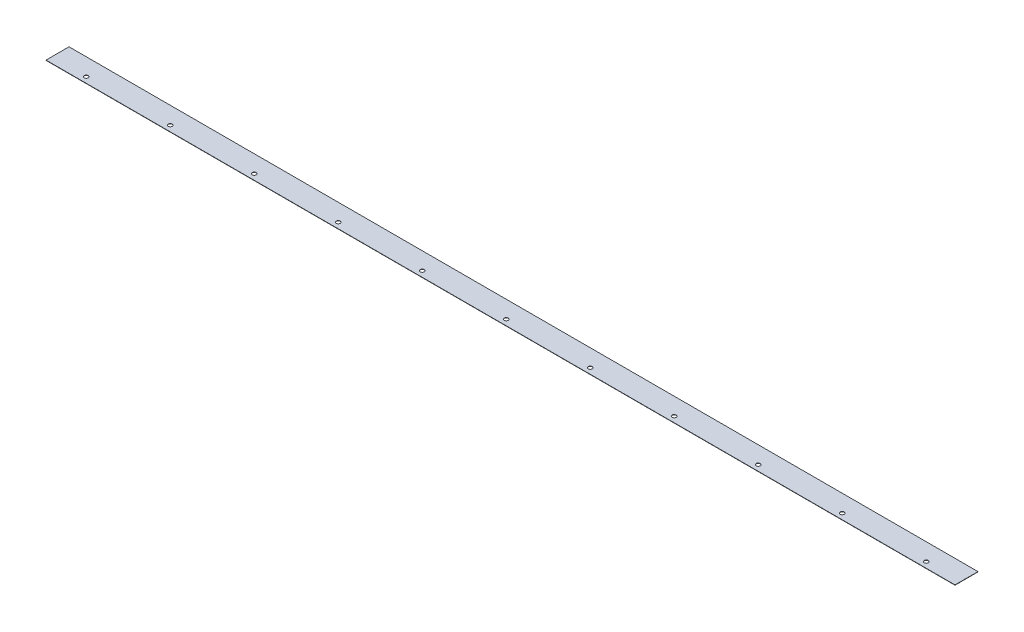
ISO-10303-21;
HEADER;
FILE_DESCRIPTION(('STEP AP214'),'2;1');
FILE_NAME('part.step','',(''),(''),'','','');
FILE_SCHEMA(('AUTOMOTIVE_DESIGN { 1 0 10303 214 1 1 1 1 }'));
ENDSEC;
DATA;
#1=APPLICATION_CONTEXT('core data for automotive mechanical design processes');
#2=APPLICATION_PROTOCOL_DEFINITION('international standard','automotive_design',2000,#1);
#3=PRODUCT_CONTEXT('',#1,'mechanical');
#4=PRODUCT('Part','Part','',(#3));
#5=PRODUCT_RELATED_PRODUCT_CATEGORY('part','',(#4));
#6=PRODUCT_DEFINITION_FORMATION('','',#4);
#7=PRODUCT_DEFINITION_CONTEXT('part definition',#1,'design');
#8=PRODUCT_DEFINITION('design','',#6,#7);
#9=PRODUCT_DEFINITION_SHAPE('','',#8);
#10=(LENGTH_UNIT() NAMED_UNIT(*) SI_UNIT(.MILLI.,.METRE.));
#11=(NAMED_UNIT(*) PLANE_ANGLE_UNIT() SI_UNIT($,.RADIAN.));
#12=(NAMED_UNIT(*) SI_UNIT($,.STERADIAN.) SOLID_ANGLE_UNIT());
#13=UNCERTAINTY_MEASURE_WITH_UNIT(LENGTH_MEASURE(1.E-05),#10,'distance_accuracy_value','');
#14=(GEOMETRIC_REPRESENTATION_CONTEXT(3) GLOBAL_UNCERTAINTY_ASSIGNED_CONTEXT((#13)) GLOBAL_UNIT_ASSIGNED_CONTEXT((#10,
#11,#12)) REPRESENTATION_CONTEXT('',''));
#15=CARTESIAN_POINT('',(0.,0.,0.));
#16=DIRECTION('',(0.,0.,1.));
#17=DIRECTION('',(1.,0.,0.));
#18=AXIS2_PLACEMENT_3D('',#15,#16,#17);
#19=CARTESIAN_POINT('',(790.000000000001,-0.499999999999806,20.));
#20=DIRECTION('',(1.,0.,0.));
#21=DIRECTION('',(0.,0.,-1.00000000000001));
#22=AXIS2_PLACEMENT_3D('',#19,#20,#21);
#23=PLANE('',#22);
#24=DIRECTION('',(0.,0.,-1.00000000000001));
#25=VECTOR('',#24,1.);
#26=CARTESIAN_POINT('',(790.000000000001,2.4980018054066E-13,19.9999999999999));
#27=LINE('',#26,#25);
#28=CARTESIAN_POINT('',(790.000000000001,2.4980018054066E-13,19.9999999999999));
#29=VERTEX_POINT('',#28);
#30=CARTESIAN_POINT('',(790.000000000001,2.4980018054066E-13,-19.9999999999998));
#31=VERTEX_POINT('',#30);
#32=EDGE_CURVE('E103',#29,#31,#27,.T.);
#33=ORIENTED_EDGE('',*,*,#32,.F.);
#34=DIRECTION('',(0.,1.,0.));
#35=VECTOR('',#34,1.);
#36=CARTESIAN_POINT('',(790.000000000001,-0.499999999999806,20.));
#37=LINE('',#36,#35);
#38=CARTESIAN_POINT('',(790.000000000001,-0.499999999999806,20.));
#39=VERTEX_POINT('',#38);
#40=EDGE_CURVE('E11',#39,#29,#37,.T.);
#41=ORIENTED_EDGE('',*,*,#40,.F.);
#42=DIRECTION('',(0.,0.,-1.00000000000001));
#43=VECTOR('',#42,1.);
#44=CARTESIAN_POINT('',(790.000000000001,-0.499999999999806,20.));
#45=LINE('',#44,#43);
#46=CARTESIAN_POINT('',(790.000000000001,-0.5,-20.));
#47=VERTEX_POINT('',#46);
#48=EDGE_CURVE('E96',#39,#47,#45,.T.);
#49=ORIENTED_EDGE('',*,*,#48,.T.);
#50=DIRECTION('',(0.,1.,0.));
#51=VECTOR('',#50,1.);
#52=CARTESIAN_POINT('',(790.000000000001,-0.5,-20.));
#53=LINE('',#52,#51);
#54=EDGE_CURVE('E41',#47,#31,#53,.T.);
#55=ORIENTED_EDGE('',*,*,#54,.T.);
#56=EDGE_LOOP('',(#33,#41,#49,#55));
#57=FACE_BOUND('',#56,.T.);
#58=ADVANCED_FACE('F38',(#57),#23,.T.);
#59=CARTESIAN_POINT('',(-790.000000000003,-0.500000000000334,20.));
#60=DIRECTION('',(0.,0.,1.00000000000001));
#61=DIRECTION('',(1.,0.,0.));
#62=AXIS2_PLACEMENT_3D('',#59,#60,#61);
#63=PLANE('',#62);
#64=DIRECTION('',(1.,0.,0.));
#65=VECTOR('',#64,1.);
#66=CARTESIAN_POINT('',(-790.000000000003,0.,20.0000000000001));
#67=LINE('',#66,#65);
#68=CARTESIAN_POINT('',(-790.000000000003,0.,20.0000000000001));
#69=VERTEX_POINT('',#68);
#70=EDGE_CURVE('E98',#69,#29,#67,.T.);
#71=ORIENTED_EDGE('',*,*,#70,.F.);
#72=DIRECTION('',(0.,1.,0.));
#73=VECTOR('',#72,1.);
#74=CARTESIAN_POINT('',(-790.000000000003,-0.500000000000334,20.));
#75=LINE('',#74,#73);
#76=CARTESIAN_POINT('',(-790.000000000003,-0.500000000000334,20.));
#77=VERTEX_POINT('',#76);
#78=EDGE_CURVE('E47',#77,#69,#75,.T.);
#79=ORIENTED_EDGE('',*,*,#78,.F.);
#80=DIRECTION('',(1.,0.,0.));
#81=VECTOR('',#80,1.);
#82=CARTESIAN_POINT('',(-790.000000000003,-0.500000000000334,20.));
#83=LINE('',#82,#81);
#84=EDGE_CURVE('E93',#77,#39,#83,.T.);
#85=ORIENTED_EDGE('',*,*,#84,.T.);
#86=ORIENTED_EDGE('',*,*,#40,.T.);
#87=EDGE_LOOP('',(#71,#79,#85,#86));
#88=FACE_BOUND('',#87,.T.);
#89=ADVANCED_FACE('F114',(#88),#63,.T.);
#90=CARTESIAN_POINT('',(-790.000000000003,-0.500000000000334,20.));
#91=DIRECTION('',(-1.,0.,0.));
#92=DIRECTION('',(0.,0.,1.00000000000001));
#93=AXIS2_PLACEMENT_3D('',#90,#91,#92);
#94=PLANE('',#93);
#95=DIRECTION('',(0.,0.,1.00000000000001));
#96=VECTOR('',#95,1.);
#97=CARTESIAN_POINT('',(-790.000000000003,0.,20.0000000000001));
#98=LINE('',#97,#96);
#99=CARTESIAN_POINT('',(-790.000000000004,1.11022302462516E-13,-19.9999999999997));
#100=VERTEX_POINT('',#99);
#101=EDGE_CURVE('E88',#100,#69,#98,.T.);
#102=ORIENTED_EDGE('',*,*,#101,.F.);
#103=DIRECTION('',(0.,1.,0.));
#104=VECTOR('',#103,1.);
#105=CARTESIAN_POINT('',(-790.000000000004,-0.499999999999778,-19.9999999999999));
#106=LINE('',#105,#104);
#107=CARTESIAN_POINT('',(-790.000000000004,-0.499999999999778,-19.9999999999999));
#108=VERTEX_POINT('',#107);
#109=EDGE_CURVE('E83',#108,#100,#106,.T.);
#110=ORIENTED_EDGE('',*,*,#109,.F.);
#111=DIRECTION('',(0.,0.,1.00000000000001));
#112=VECTOR('',#111,1.);
#113=CARTESIAN_POINT('',(-790.000000000003,-0.500000000000334,20.));
#114=LINE('',#113,#112);
#115=EDGE_CURVE('E86',#108,#77,#114,.T.);
#116=ORIENTED_EDGE('',*,*,#115,.T.);
#117=ORIENTED_EDGE('',*,*,#78,.T.);
#118=EDGE_LOOP('',(#102,#110,#116,#117));
#119=FACE_BOUND('',#118,.T.);
#120=ADVANCED_FACE('F85',(#119),#94,.T.);
#121=CARTESIAN_POINT('',(-790.000000000004,-0.499999999999778,-19.9999999999999));
#122=DIRECTION('',(0.,0.,-1.00000000000001));
#123=DIRECTION('',(-1.,0.,0.));
#124=AXIS2_PLACEMENT_3D('',#121,#122,#123);
#125=PLANE('',#124);
#126=DIRECTION('',(-1.,0.,0.));
#127=VECTOR('',#126,1.);
#128=CARTESIAN_POINT('',(-790.000000000004,1.11022302462516E-13,-19.9999999999997));
#129=LINE('',#128,#127);
#130=EDGE_CURVE('E106',#31,#100,#129,.T.);
#131=ORIENTED_EDGE('',*,*,#130,.F.);
#132=ORIENTED_EDGE('',*,*,#54,.F.);
#133=DIRECTION('',(-1.,0.,0.));
#134=VECTOR('',#133,1.);
#135=CARTESIAN_POINT('',(-790.000000000004,-0.499999999999778,-19.9999999999999));
#136=LINE('',#135,#134);
#137=EDGE_CURVE('E92',#47,#108,#136,.T.);
#138=ORIENTED_EDGE('',*,*,#137,.T.);
#139=ORIENTED_EDGE('',*,*,#109,.T.);
#140=EDGE_LOOP('',(#131,#132,#138,#139));
#141=FACE_BOUND('',#140,.T.);
#142=ADVANCED_FACE('F95',(#141),#125,.T.);
#143=CARTESIAN_POINT('',(0.,-0.499999999999889,2.08166817117217E-13));
#144=DIRECTION('',(0.,-1.,0.));
#145=DIRECTION('',(0.,0.,-1.00000000000001));
#146=AXIS2_PLACEMENT_3D('',#143,#144,#145);
#147=PLANE('',#146);
#148=CARTESIAN_POINT('',(730.,-0.500000000000028,10.0000000000001));
#149=DIRECTION('',(0.,-1.,0.));
#150=DIRECTION('',(0.,0.,-1.00000000000001));
#151=AXIS2_PLACEMENT_3D('',#148,#149,#150);
#152=CIRCLE('',#151,3.5);
#153=CARTESIAN_POINT('',(730.,-0.500000000000028,6.50000000000013));
#154=VERTEX_POINT('',#153);
#155=EDGE_CURVE('E239',#154,#154,#152,.T.);
#156=ORIENTED_EDGE('',*,*,#155,.F.);
#157=EDGE_LOOP('',(#156));
#158=FACE_BOUND('',#157,.T.);
#159=CARTESIAN_POINT('',(584.,-0.499999999999889,10.0000000000002));
#160=DIRECTION('',(0.,-1.,0.));
#161=DIRECTION('',(0.,0.,-1.00000000000001));
#162=AXIS2_PLACEMENT_3D('',#159,#160,#161);
#163=CIRCLE('',#162,3.5);
#164=CARTESIAN_POINT('',(584.,-0.499999999999889,6.50000000000021));
#165=VERTEX_POINT('',#164);
#166=EDGE_CURVE('E233',#165,#165,#163,.T.);
#167=ORIENTED_EDGE('',*,*,#166,.F.);
#168=EDGE_LOOP('',(#167));
#169=FACE_BOUND('',#168,.T.);
#170=CARTESIAN_POINT('',(438.000000000001,-0.500000000000167,10.0000000000001));
#171=DIRECTION('',(0.,-1.,0.));
#172=DIRECTION('',(0.,0.,-1.00000000000001));
#173=AXIS2_PLACEMENT_3D('',#170,#171,#172);
#174=CIRCLE('',#173,3.5);
#175=CARTESIAN_POINT('',(438.000000000001,-0.500000000000167,6.5000000000001));
#176=VERTEX_POINT('',#175);
#177=EDGE_CURVE('E227',#176,#176,#174,.T.);
#178=ORIENTED_EDGE('',*,*,#177,.F.);
#179=EDGE_LOOP('',(#178));
#180=FACE_BOUND('',#179,.T.);
#181=CARTESIAN_POINT('',(292.000000000001,-0.500000000000028,10.0000000000001));
#182=DIRECTION('',(0.,-1.,0.));
#183=DIRECTION('',(0.,0.,-1.00000000000001));
#184=AXIS2_PLACEMENT_3D('',#181,#182,#183);
#185=CIRCLE('',#184,3.5);
#186=CARTESIAN_POINT('',(292.000000000001,-0.500000000000028,6.50000000000009));
#187=VERTEX_POINT('',#186);
#188=EDGE_CURVE('E221',#187,#187,#185,.T.);
#189=ORIENTED_EDGE('',*,*,#188,.F.);
#190=EDGE_LOOP('',(#189));
#191=FACE_BOUND('',#190,.T.);
#192=CARTESIAN_POINT('',(146.,-0.499999999999917,10.0000000000004));
#193=DIRECTION('',(0.,-1.,0.));
#194=DIRECTION('',(0.,0.,-1.00000000000001));
#195=AXIS2_PLACEMENT_3D('',#192,#193,#194);
#196=CIRCLE('',#195,3.5);
#197=CARTESIAN_POINT('',(146.,-0.499999999999917,6.50000000000035));
#198=VERTEX_POINT('',#197);
#199=EDGE_CURVE('E215',#198,#198,#196,.T.);
#200=ORIENTED_EDGE('',*,*,#199,.F.);
#201=EDGE_LOOP('',(#200));
#202=FACE_BOUND('',#201,.T.);
#203=CARTESIAN_POINT('',(-730.000000000002,-0.499999999999889,10.0000000000001));
#204=DIRECTION('',(0.,-1.,0.));
#205=DIRECTION('',(0.,0.,-1.00000000000001));
#206=AXIS2_PLACEMENT_3D('',#203,#204,#205);
#207=CIRCLE('',#206,3.5);
#208=CARTESIAN_POINT('',(-730.000000000002,-0.499999999999889,6.50000000000013));
#209=VERTEX_POINT('',#208);
#210=EDGE_CURVE('E209',#209,#209,#207,.T.);
#211=ORIENTED_EDGE('',*,*,#210,.F.);
#212=EDGE_LOOP('',(#211));
#213=FACE_BOUND('',#212,.T.);
#214=CARTESIAN_POINT('',(-584.000000000002,-0.500000000000056,10.0000000000002));
#215=DIRECTION('',(0.,-1.,0.));
#216=DIRECTION('',(0.,0.,-1.00000000000001));
#217=AXIS2_PLACEMENT_3D('',#214,#215,#216);
#218=CIRCLE('',#217,3.5);
#219=CARTESIAN_POINT('',(-584.000000000002,-0.500000000000056,6.50000000000023));
#220=VERTEX_POINT('',#219);
#221=EDGE_CURVE('E203',#220,#220,#218,.T.);
#222=ORIENTED_EDGE('',*,*,#221,.F.);
#223=EDGE_LOOP('',(#222));
#224=FACE_BOUND('',#223,.T.);
#225=CARTESIAN_POINT('',(-438.000000000001,-0.499999999999889,10.0000000000004));
#226=DIRECTION('',(0.,-1.,0.));
#227=DIRECTION('',(0.,0.,-1.00000000000001));
#228=AXIS2_PLACEMENT_3D('',#225,#226,#227);
#229=CIRCLE('',#228,3.5);
#230=CARTESIAN_POINT('',(-438.000000000001,-0.499999999999889,6.50000000000042));
#231=VERTEX_POINT('',#230);
#232=EDGE_CURVE('E197',#231,#231,#229,.T.);
#233=ORIENTED_EDGE('',*,*,#232,.F.);
#234=EDGE_LOOP('',(#233));
#235=FACE_BOUND('',#234,.T.);
#236=CARTESIAN_POINT('',(-292.,-0.5,10.0000000000002));
#237=DIRECTION('',(0.,-1.,0.));
#238=DIRECTION('',(0.,0.,-1.00000000000001));
#239=AXIS2_PLACEMENT_3D('',#236,#237,#238);
#240=CIRCLE('',#239,3.5);
#241=CARTESIAN_POINT('',(-292.,-0.5,6.50000000000014));
#242=VERTEX_POINT('',#241);
#243=EDGE_CURVE('E184',#242,#242,#240,.T.);
#244=ORIENTED_EDGE('',*,*,#243,.F.);
#245=EDGE_LOOP('',(#244));
#246=FACE_BOUND('',#245,.T.);
#247=CARTESIAN_POINT('',(-146.,-0.499999999999862,10.0000000000001));
#248=DIRECTION('',(0.,-1.,0.));
#249=DIRECTION('',(0.,0.,-1.00000000000001));
#250=AXIS2_PLACEMENT_3D('',#247,#248,#249);
#251=CIRCLE('',#250,3.5);
#252=CARTESIAN_POINT('',(-146.,-0.499999999999861,6.50000000000005));
#253=VERTEX_POINT('',#252);
#254=EDGE_CURVE('E189',#253,#253,#251,.T.);
#255=ORIENTED_EDGE('',*,*,#254,.F.);
#256=EDGE_LOOP('',(#255));
#257=FACE_BOUND('',#256,.T.);
#258=CARTESIAN_POINT('',(0.,-0.499999999999973,10.));
#259=DIRECTION('',(0.,-1.,0.));
#260=DIRECTION('',(0.,0.,-1.00000000000001));
#261=AXIS2_PLACEMENT_3D('',#258,#259,#260);
#262=CIRCLE('',#261,3.5);
#263=CARTESIAN_POINT('',(0.,-0.499999999999972,6.50000000000001));
#264=VERTEX_POINT('',#263);
#265=EDGE_CURVE('E107',#264,#264,#262,.T.);
#266=ORIENTED_EDGE('',*,*,#265,.F.);
#267=EDGE_LOOP('',(#266));
#268=FACE_BOUND('',#267,.T.);
#269=ORIENTED_EDGE('',*,*,#48,.F.);
#270=ORIENTED_EDGE('',*,*,#84,.F.);
#271=ORIENTED_EDGE('',*,*,#115,.F.);
#272=ORIENTED_EDGE('',*,*,#137,.F.);
#273=EDGE_LOOP('',(#269,#270,#271,#272));
#274=FACE_BOUND('',#273,.T.);
#275=ADVANCED_FACE('F91',(#158,#169,#180,#191,#202,#213,#224,#235,#246,#257,#268,#274),#147,.T.);
#276=CARTESIAN_POINT('',(0.,0.,0.));
#277=DIRECTION('',(0.,-1.,0.));
#278=DIRECTION('',(0.,0.,-1.00000000000001));
#279=AXIS2_PLACEMENT_3D('',#276,#277,#278);
#280=PLANE('',#279);
#281=CARTESIAN_POINT('',(730.,-1.11022302462516E-13,10.0000000000001));
#282=DIRECTION('',(0.,1.,0.));
#283=DIRECTION('',(0.,0.,1.00000000000001));
#284=AXIS2_PLACEMENT_3D('',#281,#282,#283);
#285=CIRCLE('',#284,3.5);
#286=CARTESIAN_POINT('',(730.,-1.11216591491825E-13,13.5000000000001));
#287=VERTEX_POINT('',#286);
#288=EDGE_CURVE('E236',#287,#287,#285,.T.);
#289=ORIENTED_EDGE('',*,*,#288,.F.);
#290=EDGE_LOOP('',(#289));
#291=FACE_BOUND('',#290,.T.);
#292=CARTESIAN_POINT('',(584.,0.,10.));
#293=DIRECTION('',(0.,1.,0.));
#294=DIRECTION('',(0.,0.,1.00000000000001));
#295=AXIS2_PLACEMENT_3D('',#292,#293,#294);
#296=CIRCLE('',#295,3.5);
#297=CARTESIAN_POINT('',(584.,0.,13.5000000000001));
#298=VERTEX_POINT('',#297);
#299=EDGE_CURVE('E230',#298,#298,#296,.T.);
#300=ORIENTED_EDGE('',*,*,#299,.F.);
#301=EDGE_LOOP('',(#300));
#302=FACE_BOUND('',#301,.T.);
#303=CARTESIAN_POINT('',(438.000000000001,-1.66533453693773E-13,10.0000000000001));
#304=DIRECTION('',(0.,1.,0.));
#305=DIRECTION('',(0.,0.,1.00000000000001));
#306=AXIS2_PLACEMENT_3D('',#303,#304,#305);
#307=CIRCLE('',#306,3.5);
#308=CARTESIAN_POINT('',(438.000000000001,-1.66727742723083E-13,13.5000000000001));
#309=VERTEX_POINT('',#308);
#310=EDGE_CURVE('E224',#309,#309,#307,.T.);
#311=ORIENTED_EDGE('',*,*,#310,.F.);
#312=EDGE_LOOP('',(#311));
#313=FACE_BOUND('',#312,.T.);
#314=CARTESIAN_POINT('',(292.000000000001,-2.22044604925031E-13,10.0000000000001));
#315=DIRECTION('',(0.,1.,0.));
#316=DIRECTION('',(0.,0.,1.00000000000001));
#317=AXIS2_PLACEMENT_3D('',#314,#315,#316);
#318=CIRCLE('',#317,3.5);
#319=CARTESIAN_POINT('',(292.000000000001,-2.22238893954341E-13,13.5000000000001));
#320=VERTEX_POINT('',#319);
#321=EDGE_CURVE('E218',#320,#320,#318,.T.);
#322=ORIENTED_EDGE('',*,*,#321,.F.);
#323=EDGE_LOOP('',(#322));
#324=FACE_BOUND('',#323,.T.);
#325=CARTESIAN_POINT('',(146.,-3.05311331771918E-13,10.0000000000001));
#326=DIRECTION('',(0.,1.,0.));
#327=DIRECTION('',(0.,0.,1.00000000000001));
#328=AXIS2_PLACEMENT_3D('',#325,#326,#327);
#329=CIRCLE('',#328,3.5);
#330=CARTESIAN_POINT('',(146.,-3.05505620801227E-13,13.5000000000001));
#331=VERTEX_POINT('',#330);
#332=EDGE_CURVE('E212',#331,#331,#329,.T.);
#333=ORIENTED_EDGE('',*,*,#332,.F.);
#334=EDGE_LOOP('',(#333));
#335=FACE_BOUND('',#334,.T.);
#336=CARTESIAN_POINT('',(-730.000000000002,0.,10.0000000000002));
#337=DIRECTION('',(0.,1.,0.));
#338=DIRECTION('',(0.,0.,1.00000000000001));
#339=AXIS2_PLACEMENT_3D('',#336,#337,#338);
#340=CIRCLE('',#339,3.5);
#341=CARTESIAN_POINT('',(-730.000000000002,0.,13.5000000000002));
#342=VERTEX_POINT('',#341);
#343=EDGE_CURVE('E206',#342,#342,#340,.T.);
#344=ORIENTED_EDGE('',*,*,#343,.F.);
#345=EDGE_LOOP('',(#344));
#346=FACE_BOUND('',#345,.T.);
#347=CARTESIAN_POINT('',(-584.000000000002,-1.11022302462516E-13,10.0000000000001));
#348=DIRECTION('',(0.,1.,0.));
#349=DIRECTION('',(0.,0.,1.00000000000001));
#350=AXIS2_PLACEMENT_3D('',#347,#348,#349);
#351=CIRCLE('',#350,3.5);
#352=CARTESIAN_POINT('',(-584.000000000002,-1.11216591491825E-13,13.5000000000001));
#353=VERTEX_POINT('',#352);
#354=EDGE_CURVE('E200',#353,#353,#351,.T.);
#355=ORIENTED_EDGE('',*,*,#354,.F.);
#356=EDGE_LOOP('',(#355));
#357=FACE_BOUND('',#356,.T.);
#358=CARTESIAN_POINT('',(-438.000000000001,0.,10.0000000000001));
#359=DIRECTION('',(0.,1.,0.));
#360=DIRECTION('',(0.,0.,1.00000000000001));
#361=AXIS2_PLACEMENT_3D('',#358,#359,#360);
#362=CIRCLE('',#361,3.5);
#363=CARTESIAN_POINT('',(-438.000000000001,0.,13.5000000000001));
#364=VERTEX_POINT('',#363);
#365=EDGE_CURVE('E194',#364,#364,#362,.T.);
#366=ORIENTED_EDGE('',*,*,#365,.F.);
#367=EDGE_LOOP('',(#366));
#368=FACE_BOUND('',#367,.T.);
#369=CARTESIAN_POINT('',(-292.,0.,10.0000000000001));
#370=DIRECTION('',(0.,1.,0.));
#371=DIRECTION('',(0.,0.,1.00000000000001));
#372=AXIS2_PLACEMENT_3D('',#369,#370,#371);
#373=CIRCLE('',#372,3.5);
#374=CARTESIAN_POINT('',(-292.,0.,13.5000000000001));
#375=VERTEX_POINT('',#374);
#376=EDGE_CURVE('E187',#375,#375,#373,.T.);
#377=ORIENTED_EDGE('',*,*,#376,.F.);
#378=EDGE_LOOP('',(#377));
#379=FACE_BOUND('',#378,.T.);
#380=CARTESIAN_POINT('',(-146.,0.,10.));
#381=DIRECTION('',(0.,1.,0.));
#382=DIRECTION('',(0.,0.,1.00000000000001));
#383=AXIS2_PLACEMENT_3D('',#380,#381,#382);
#384=CIRCLE('',#383,3.5);
#385=CARTESIAN_POINT('',(-146.,0.,13.5));
#386=VERTEX_POINT('',#385);
#387=EDGE_CURVE('E192',#386,#386,#384,.T.);
#388=ORIENTED_EDGE('',*,*,#387,.F.);
#389=EDGE_LOOP('',(#388));
#390=FACE_BOUND('',#389,.T.);
#391=CARTESIAN_POINT('',(0.,0.,10.0000000000001));
#392=DIRECTION('',(0.,1.,0.));
#393=DIRECTION('',(0.,0.,1.00000000000001));
#394=AXIS2_PLACEMENT_3D('',#391,#392,#393);
#395=CIRCLE('',#394,3.5);
#396=CARTESIAN_POINT('',(0.,0.,13.5000000000001));
#397=VERTEX_POINT('',#396);
#398=EDGE_CURVE('E246',#397,#397,#395,.T.);
#399=ORIENTED_EDGE('',*,*,#398,.F.);
#400=EDGE_LOOP('',(#399));
#401=FACE_BOUND('',#400,.T.);
#402=ORIENTED_EDGE('',*,*,#32,.T.);
#403=ORIENTED_EDGE('',*,*,#130,.T.);
#404=ORIENTED_EDGE('',*,*,#101,.T.);
#405=ORIENTED_EDGE('',*,*,#70,.T.);
#406=EDGE_LOOP('',(#402,#403,#404,#405));
#407=FACE_BOUND('',#406,.T.);
#408=ADVANCED_FACE('F113',(#291,#302,#313,#324,#335,#346,#357,#368,#379,#390,#401,#407),#280,.F.);
#409=CARTESIAN_POINT('',(0.,-9.99999999999995,10.));
#410=DIRECTION('',(0.,1.,0.));
#411=DIRECTION('',(0.,0.,1.00000000000001));
#412=AXIS2_PLACEMENT_3D('',#409,#410,#411);
#413=CYLINDRICAL_SURFACE('',#412,3.5);
#414=ORIENTED_EDGE('',*,*,#265,.T.);
#415=EDGE_LOOP('',(#414));
#416=FACE_BOUND('',#415,.T.);
#417=ORIENTED_EDGE('',*,*,#398,.T.);
#418=EDGE_LOOP('',(#417));
#419=FACE_BOUND('',#418,.T.);
#420=ADVANCED_FACE('F132',(#416,#419),#413,.F.);
#421=CARTESIAN_POINT('',(-146.,-9.99999999999984,10.0000000000003));
#422=DIRECTION('',(0.,1.,0.));
#423=DIRECTION('',(0.,0.,1.00000000000001));
#424=AXIS2_PLACEMENT_3D('',#421,#422,#423);
#425=CYLINDRICAL_SURFACE('',#424,3.5);
#426=ORIENTED_EDGE('',*,*,#254,.T.);
#427=EDGE_LOOP('',(#426));
#428=FACE_BOUND('',#427,.T.);
#429=ORIENTED_EDGE('',*,*,#387,.T.);
#430=EDGE_LOOP('',(#429));
#431=FACE_BOUND('',#430,.T.);
#432=ADVANCED_FACE('F139',(#428,#431),#425,.F.);
#433=CARTESIAN_POINT('',(-292.,-9.99999999999973,10.0000000000003));
#434=DIRECTION('',(0.,1.,0.));
#435=DIRECTION('',(0.,0.,1.00000000000001));
#436=AXIS2_PLACEMENT_3D('',#433,#434,#435);
#437=CYLINDRICAL_SURFACE('',#436,3.5);
#438=ORIENTED_EDGE('',*,*,#243,.T.);
#439=EDGE_LOOP('',(#438));
#440=FACE_BOUND('',#439,.T.);
#441=ORIENTED_EDGE('',*,*,#376,.T.);
#442=EDGE_LOOP('',(#441));
#443=FACE_BOUND('',#442,.T.);
#444=ADVANCED_FACE('F143',(#440,#443),#437,.F.);
#445=CARTESIAN_POINT('',(-438.000000000001,-9.99999999999973,10.));
#446=DIRECTION('',(0.,1.,0.));
#447=DIRECTION('',(0.,0.,1.00000000000001));
#448=AXIS2_PLACEMENT_3D('',#445,#446,#447);
#449=CYLINDRICAL_SURFACE('',#448,3.5);
#450=ORIENTED_EDGE('',*,*,#232,.T.);
#451=EDGE_LOOP('',(#450));
#452=FACE_BOUND('',#451,.T.);
#453=ORIENTED_EDGE('',*,*,#365,.T.);
#454=EDGE_LOOP('',(#453));
#455=FACE_BOUND('',#454,.T.);
#456=ADVANCED_FACE('F172',(#452,#455),#449,.F.);
#457=CARTESIAN_POINT('',(-584.000000000002,-9.99999999999984,10.0000000000002));
#458=DIRECTION('',(0.,1.,0.));
#459=DIRECTION('',(0.,0.,1.00000000000001));
#460=AXIS2_PLACEMENT_3D('',#457,#458,#459);
#461=CYLINDRICAL_SURFACE('',#460,3.5);
#462=ORIENTED_EDGE('',*,*,#221,.T.);
#463=EDGE_LOOP('',(#462));
#464=FACE_BOUND('',#463,.T.);
#465=ORIENTED_EDGE('',*,*,#354,.T.);
#466=EDGE_LOOP('',(#465));
#467=FACE_BOUND('',#466,.T.);
#468=ADVANCED_FACE('F168',(#464,#467),#461,.F.);
#469=CARTESIAN_POINT('',(-730.000000000002,-9.99999999999962,10.0000000000004));
#470=DIRECTION('',(0.,1.,0.));
#471=DIRECTION('',(0.,0.,1.00000000000001));
#472=AXIS2_PLACEMENT_3D('',#469,#470,#471);
#473=CYLINDRICAL_SURFACE('',#472,3.5);
#474=ORIENTED_EDGE('',*,*,#210,.T.);
#475=EDGE_LOOP('',(#474));
#476=FACE_BOUND('',#475,.T.);
#477=ORIENTED_EDGE('',*,*,#343,.T.);
#478=EDGE_LOOP('',(#477));
#479=FACE_BOUND('',#478,.T.);
#480=ADVANCED_FACE('F164',(#476,#479),#473,.F.);
#481=CARTESIAN_POINT('',(146.,-10.0000000000002,10.0000000000001));
#482=DIRECTION('',(0.,1.,0.));
#483=DIRECTION('',(0.,0.,1.00000000000001));
#484=AXIS2_PLACEMENT_3D('',#481,#482,#483);
#485=CYLINDRICAL_SURFACE('',#484,3.5);
#486=ORIENTED_EDGE('',*,*,#199,.T.);
#487=EDGE_LOOP('',(#486));
#488=FACE_BOUND('',#487,.T.);
#489=ORIENTED_EDGE('',*,*,#332,.T.);
#490=EDGE_LOOP('',(#489));
#491=FACE_BOUND('',#490,.T.);
#492=ADVANCED_FACE('F160',(#488,#491),#485,.F.);
#493=CARTESIAN_POINT('',(292.000000000001,-9.99999999999984,10.0000000000001));
#494=DIRECTION('',(0.,1.,0.));
#495=DIRECTION('',(0.,0.,1.00000000000001));
#496=AXIS2_PLACEMENT_3D('',#493,#494,#495);
#497=CYLINDRICAL_SURFACE('',#496,3.5);
#498=ORIENTED_EDGE('',*,*,#188,.T.);
#499=EDGE_LOOP('',(#498));
#500=FACE_BOUND('',#499,.T.);
#501=ORIENTED_EDGE('',*,*,#321,.T.);
#502=EDGE_LOOP('',(#501));
#503=FACE_BOUND('',#502,.T.);
#504=ADVANCED_FACE('F156',(#500,#503),#497,.F.);
#505=CARTESIAN_POINT('',(438.000000000001,-10.0000000000002,10.0000000000001));
#506=DIRECTION('',(0.,1.,0.));
#507=DIRECTION('',(0.,0.,1.00000000000001));
#508=AXIS2_PLACEMENT_3D('',#505,#506,#507);
#509=CYLINDRICAL_SURFACE('',#508,3.5);
#510=ORIENTED_EDGE('',*,*,#177,.T.);
#511=EDGE_LOOP('',(#510));
#512=FACE_BOUND('',#511,.T.);
#513=ORIENTED_EDGE('',*,*,#310,.T.);
#514=EDGE_LOOP('',(#513));
#515=FACE_BOUND('',#514,.T.);
#516=ADVANCED_FACE('F152',(#512,#515),#509,.F.);
#517=CARTESIAN_POINT('',(584.,-10.0000000000002,10.0000000000001));
#518=DIRECTION('',(0.,1.,0.));
#519=DIRECTION('',(0.,0.,1.00000000000001));
#520=AXIS2_PLACEMENT_3D('',#517,#518,#519);
#521=CYLINDRICAL_SURFACE('',#520,3.5);
#522=ORIENTED_EDGE('',*,*,#166,.T.);
#523=EDGE_LOOP('',(#522));
#524=FACE_BOUND('',#523,.T.);
#525=ORIENTED_EDGE('',*,*,#299,.T.);
#526=EDGE_LOOP('',(#525));
#527=FACE_BOUND('',#526,.T.);
#528=ADVANCED_FACE('F148',(#524,#527),#521,.F.);
#529=CARTESIAN_POINT('',(730.,-9.99999999999984,9.99999999999999));
#530=DIRECTION('',(0.,1.,0.));
#531=DIRECTION('',(0.,0.,1.00000000000001));
#532=AXIS2_PLACEMENT_3D('',#529,#530,#531);
#533=CYLINDRICAL_SURFACE('',#532,3.5);
#534=ORIENTED_EDGE('',*,*,#155,.T.);
#535=EDGE_LOOP('',(#534));
#536=FACE_BOUND('',#535,.T.);
#537=ORIENTED_EDGE('',*,*,#288,.T.);
#538=EDGE_LOOP('',(#537));
#539=FACE_BOUND('',#538,.T.);
#540=ADVANCED_FACE('F145',(#536,#539),#533,.F.);
#541=CLOSED_SHELL('',(#58,#89,#120,#142,#275,#408,#420,#432,#444,#456,#468,#480,#492,#504,#516,
#528,#540));
#542=MANIFOLD_SOLID_BREP('B2',#541);
#543=ADVANCED_BREP_SHAPE_REPRESENTATION('',(#18,#542),#14);
#544=SHAPE_DEFINITION_REPRESENTATION(#9,#543);
ENDSEC;
END-ISO-10303-21;
